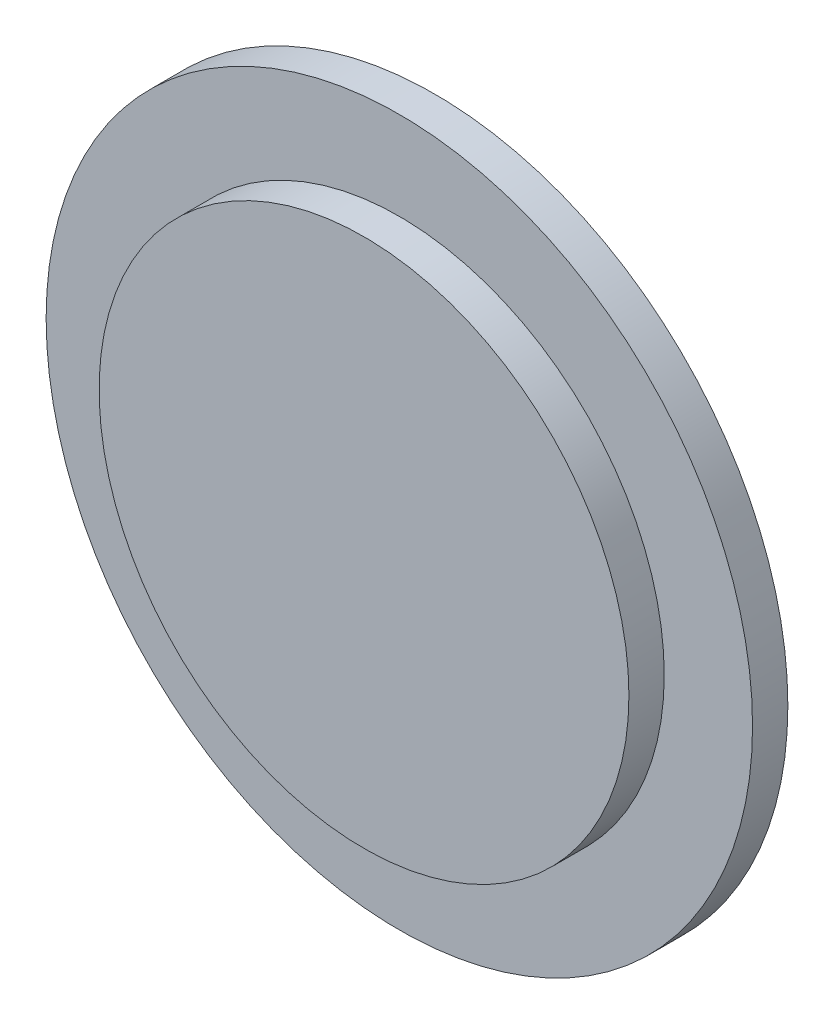
ISO-10303-21;
HEADER;
FILE_DESCRIPTION(('STEP AP214'),'2;1');
FILE_NAME('part.step','',(''),(''),'','','');
FILE_SCHEMA(('AUTOMOTIVE_DESIGN { 1 0 10303 214 1 1 1 1 }'));
ENDSEC;
DATA;
#1=APPLICATION_CONTEXT('core data for automotive mechanical design processes');
#2=APPLICATION_PROTOCOL_DEFINITION('international standard','automotive_design',2000,#1);
#3=PRODUCT_CONTEXT('',#1,'mechanical');
#4=PRODUCT('Part','Part','',(#3));
#5=PRODUCT_RELATED_PRODUCT_CATEGORY('part','',(#4));
#6=PRODUCT_DEFINITION_FORMATION('','',#4);
#7=PRODUCT_DEFINITION_CONTEXT('part definition',#1,'design');
#8=PRODUCT_DEFINITION('design','',#6,#7);
#9=PRODUCT_DEFINITION_SHAPE('','',#8);
#10=(LENGTH_UNIT() NAMED_UNIT(*) SI_UNIT(.MILLI.,.METRE.));
#11=(NAMED_UNIT(*) PLANE_ANGLE_UNIT() SI_UNIT($,.RADIAN.));
#12=(NAMED_UNIT(*) SI_UNIT($,.STERADIAN.) SOLID_ANGLE_UNIT());
#13=UNCERTAINTY_MEASURE_WITH_UNIT(LENGTH_MEASURE(1.E-05),#10,'distance_accuracy_value','');
#14=(GEOMETRIC_REPRESENTATION_CONTEXT(3) GLOBAL_UNCERTAINTY_ASSIGNED_CONTEXT((#13)) GLOBAL_UNIT_ASSIGNED_CONTEXT((#10,
#11,#12)) REPRESENTATION_CONTEXT('',''));
#15=CARTESIAN_POINT('',(0.,0.,0.));
#16=DIRECTION('',(0.,0.,1.));
#17=DIRECTION('',(1.,0.,0.));
#18=AXIS2_PLACEMENT_3D('',#15,#16,#17);
#19=CARTESIAN_POINT('',(0.,0.,1.5));
#20=DIRECTION('',(0.,0.,-1.));
#21=DIRECTION('',(-1.,0.,0.));
#22=AXIS2_PLACEMENT_3D('',#19,#20,#21);
#23=CYLINDRICAL_SURFACE('',#22,7.5);
#24=CARTESIAN_POINT('',(0.,0.,0.5));
#25=DIRECTION('',(0.,0.,1.));
#26=DIRECTION('',(1.,0.,0.));
#27=AXIS2_PLACEMENT_3D('',#24,#25,#26);
#28=CIRCLE('',#27,7.5);
#29=CARTESIAN_POINT('',(7.5,0.,0.5));
#30=VERTEX_POINT('',#29);
#31=EDGE_CURVE('E42',#30,#30,#28,.T.);
#32=ORIENTED_EDGE('',*,*,#31,.T.);
#33=EDGE_LOOP('',(#32));
#34=FACE_BOUND('',#33,.T.);
#35=CARTESIAN_POINT('',(0.,0.,1.5));
#36=DIRECTION('',(0.,0.,1.));
#37=DIRECTION('',(1.,0.,0.));
#38=AXIS2_PLACEMENT_3D('',#35,#36,#37);
#39=CIRCLE('',#38,7.5);
#40=CARTESIAN_POINT('',(7.5,0.,1.5));
#41=VERTEX_POINT('',#40);
#42=EDGE_CURVE('E47',#41,#41,#39,.T.);
#43=ORIENTED_EDGE('',*,*,#42,.F.);
#44=EDGE_LOOP('',(#43));
#45=FACE_BOUND('',#44,.T.);
#46=ADVANCED_FACE('F39',(#34,#45),#23,.T.);
#47=CARTESIAN_POINT('',(0.,0.,1.5));
#48=DIRECTION('',(0.,0.,1.));
#49=DIRECTION('',(1.,0.,0.));
#50=AXIS2_PLACEMENT_3D('',#47,#48,#49);
#51=PLANE('',#50);
#52=ORIENTED_EDGE('',*,*,#42,.T.);
#53=EDGE_LOOP('',(#52));
#54=FACE_BOUND('',#53,.T.);
#55=ADVANCED_FACE('F84',(#54),#51,.T.);
#56=CARTESIAN_POINT('',(0.,0.,0.5));
#57=DIRECTION('',(0.,0.,-1.));
#58=DIRECTION('',(-1.,0.,0.));
#59=AXIS2_PLACEMENT_3D('',#56,#57,#58);
#60=CYLINDRICAL_SURFACE('',#59,10.);
#61=CARTESIAN_POINT('',(0.,0.,0.5));
#62=DIRECTION('',(0.,0.,1.));
#63=DIRECTION('',(1.,0.,0.));
#64=AXIS2_PLACEMENT_3D('',#61,#62,#63);
#65=CIRCLE('',#64,10.);
#66=CARTESIAN_POINT('',(10.,0.,0.5));
#67=VERTEX_POINT('',#66);
#68=EDGE_CURVE('E62',#67,#67,#65,.T.);
#69=ORIENTED_EDGE('',*,*,#68,.F.);
#70=EDGE_LOOP('',(#69));
#71=FACE_BOUND('',#70,.T.);
#72=CARTESIAN_POINT('',(0.,0.,-0.5));
#73=DIRECTION('',(0.,0.,1.));
#74=DIRECTION('',(1.,0.,0.));
#75=AXIS2_PLACEMENT_3D('',#72,#73,#74);
#76=CIRCLE('',#75,10.);
#77=CARTESIAN_POINT('',(10.,0.,-0.5));
#78=VERTEX_POINT('',#77);
#79=EDGE_CURVE('E58',#78,#78,#76,.T.);
#80=ORIENTED_EDGE('',*,*,#79,.T.);
#81=EDGE_LOOP('',(#80));
#82=FACE_BOUND('',#81,.T.);
#83=ADVANCED_FACE('F76',(#71,#82),#60,.T.);
#84=CARTESIAN_POINT('',(0.,0.,0.5));
#85=DIRECTION('',(0.,0.,1.));
#86=DIRECTION('',(1.,0.,0.));
#87=AXIS2_PLACEMENT_3D('',#84,#85,#86);
#88=PLANE('',#87);
#89=ORIENTED_EDGE('',*,*,#31,.F.);
#90=EDGE_LOOP('',(#89));
#91=FACE_BOUND('',#90,.T.);
#92=ORIENTED_EDGE('',*,*,#68,.T.);
#93=EDGE_LOOP('',(#92));
#94=FACE_BOUND('',#93,.T.);
#95=ADVANCED_FACE('F73',(#91,#94),#88,.T.);
#96=CARTESIAN_POINT('',(0.,0.,-0.5));
#97=DIRECTION('',(0.,0.,1.));
#98=DIRECTION('',(1.,0.,0.));
#99=AXIS2_PLACEMENT_3D('',#96,#97,#98);
#100=PLANE('',#99);
#101=CARTESIAN_POINT('',(0.,0.,-0.5));
#102=DIRECTION('',(0.,0.,1.));
#103=DIRECTION('',(1.,0.,0.));
#104=AXIS2_PLACEMENT_3D('',#101,#102,#103);
#105=CIRCLE('',#104,7.5);
#106=CARTESIAN_POINT('',(7.5,0.,-0.5));
#107=VERTEX_POINT('',#106);
#108=EDGE_CURVE('E10',#107,#107,#105,.T.);
#109=ORIENTED_EDGE('',*,*,#108,.T.);
#110=EDGE_LOOP('',(#109));
#111=FACE_BOUND('',#110,.T.);
#112=ORIENTED_EDGE('',*,*,#79,.F.);
#113=EDGE_LOOP('',(#112));
#114=FACE_BOUND('',#113,.T.);
#115=ADVANCED_FACE('F75',(#111,#114),#100,.F.);
#116=CARTESIAN_POINT('',(0.,0.,-1.5));
#117=DIRECTION('',(0.,0.,1.));
#118=DIRECTION('',(1.,0.,0.));
#119=AXIS2_PLACEMENT_3D('',#116,#117,#118);
#120=PLANE('',#119);
#121=CARTESIAN_POINT('',(0.,0.,-1.5));
#122=DIRECTION('',(0.,0.,1.));
#123=DIRECTION('',(1.,0.,0.));
#124=AXIS2_PLACEMENT_3D('',#121,#122,#123);
#125=CIRCLE('',#124,7.5);
#126=CARTESIAN_POINT('',(7.5,0.,-1.5));
#127=VERTEX_POINT('',#126);
#128=EDGE_CURVE('E52',#127,#127,#125,.T.);
#129=ORIENTED_EDGE('',*,*,#128,.F.);
#130=EDGE_LOOP('',(#129));
#131=FACE_BOUND('',#130,.T.);
#132=ADVANCED_FACE('F82',(#131),#120,.F.);
#133=ORIENTED_EDGE('',*,*,#128,.T.);
#134=EDGE_LOOP('',(#133));
#135=FACE_BOUND('',#134,.T.);
#136=ORIENTED_EDGE('',*,*,#108,.F.);
#137=EDGE_LOOP('',(#136));
#138=FACE_BOUND('',#137,.T.);
#139=ADVANCED_FACE('F88',(#135,#138),#23,.T.);
#140=CLOSED_SHELL('',(#46,#55,#83,#95,#115,#132,#139));
#141=MANIFOLD_SOLID_BREP('B2',#140);
#142=ADVANCED_BREP_SHAPE_REPRESENTATION('',(#18,#141),#14);
#143=SHAPE_DEFINITION_REPRESENTATION(#9,#142);
ENDSEC;
END-ISO-10303-21;
